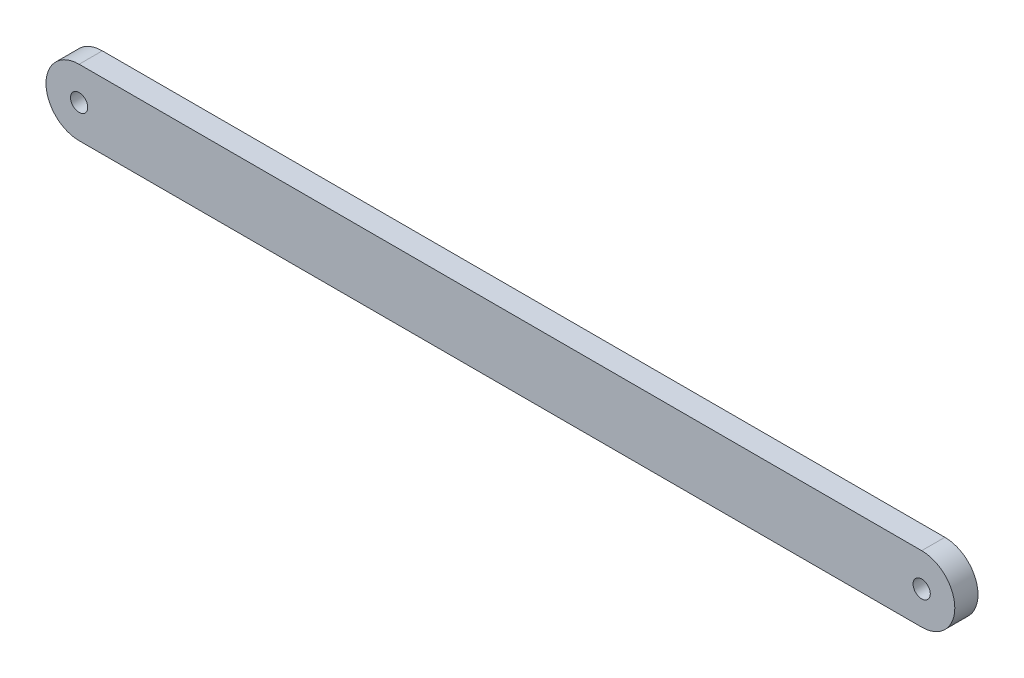
ISO-10303-21;
HEADER;
FILE_DESCRIPTION(('STEP AP214'),'2;1');
FILE_NAME('part.step','',(''),(''),'','','');
FILE_SCHEMA(('AUTOMOTIVE_DESIGN { 1 0 10303 214 1 1 1 1 }'));
ENDSEC;
DATA;
#1=APPLICATION_CONTEXT('core data for automotive mechanical design processes');
#2=APPLICATION_PROTOCOL_DEFINITION('international standard','automotive_design',2000,#1);
#3=PRODUCT_CONTEXT('',#1,'mechanical');
#4=PRODUCT('Part','Part','',(#3));
#5=PRODUCT_RELATED_PRODUCT_CATEGORY('part','',(#4));
#6=PRODUCT_DEFINITION_FORMATION('','',#4);
#7=PRODUCT_DEFINITION_CONTEXT('part definition',#1,'design');
#8=PRODUCT_DEFINITION('design','',#6,#7);
#9=PRODUCT_DEFINITION_SHAPE('','',#8);
#10=(LENGTH_UNIT() NAMED_UNIT(*) SI_UNIT(.MILLI.,.METRE.));
#11=(NAMED_UNIT(*) PLANE_ANGLE_UNIT() SI_UNIT($,.RADIAN.));
#12=(NAMED_UNIT(*) SI_UNIT($,.STERADIAN.) SOLID_ANGLE_UNIT());
#13=UNCERTAINTY_MEASURE_WITH_UNIT(LENGTH_MEASURE(1.E-05),#10,'distance_accuracy_value','');
#14=(GEOMETRIC_REPRESENTATION_CONTEXT(3) GLOBAL_UNCERTAINTY_ASSIGNED_CONTEXT((#13)) GLOBAL_UNIT_ASSIGNED_CONTEXT((#10,
#11,#12)) REPRESENTATION_CONTEXT('',''));
#15=CARTESIAN_POINT('',(0.,0.,0.));
#16=DIRECTION('',(0.,0.,1.));
#17=DIRECTION('',(1.,0.,0.));
#18=AXIS2_PLACEMENT_3D('',#15,#16,#17);
#19=CARTESIAN_POINT('',(0.,0.,-7.));
#20=DIRECTION('',(0.,0.,-1.));
#21=DIRECTION('',(1.,0.,0.));
#22=AXIS2_PLACEMENT_3D('',#19,#20,#21);
#23=PLANE('',#22);
#24=CARTESIAN_POINT('',(0.,0.,-7.));
#25=DIRECTION('',(0.,0.,1.));
#26=DIRECTION('',(1.,0.,0.));
#27=AXIS2_PLACEMENT_3D('',#24,#25,#26);
#28=CIRCLE('',#27,2.6);
#29=CARTESIAN_POINT('',(2.6,0.,-7.));
#30=VERTEX_POINT('',#29);
#31=EDGE_CURVE('E109',#30,#30,#28,.T.);
#32=ORIENTED_EDGE('',*,*,#31,.T.);
#33=EDGE_LOOP('',(#32));
#34=FACE_BOUND('',#33,.T.);
#35=CARTESIAN_POINT('',(0.,0.,-7.));
#36=DIRECTION('',(0.,0.,1.));
#37=DIRECTION('',(1.,0.,0.));
#38=AXIS2_PLACEMENT_3D('',#35,#36,#37);
#39=CIRCLE('',#38,10.);
#40=CARTESIAN_POINT('',(0.,10.,-7.));
#41=VERTEX_POINT('',#40);
#42=CARTESIAN_POINT('',(0.,-10.,-7.));
#43=VERTEX_POINT('',#42);
#44=EDGE_CURVE('E97',#41,#43,#39,.T.);
#45=ORIENTED_EDGE('',*,*,#44,.F.);
#46=DIRECTION('',(-1.,0.,0.));
#47=VECTOR('',#46,1.);
#48=CARTESIAN_POINT('',(0.,10.,-7.));
#49=LINE('',#48,#47);
#50=CARTESIAN_POINT('',(254.32,10.,-7.));
#51=VERTEX_POINT('',#50);
#52=EDGE_CURVE('E100',#51,#41,#49,.T.);
#53=ORIENTED_EDGE('',*,*,#52,.F.);
#54=CARTESIAN_POINT('',(254.32,0.,-7.));
#55=DIRECTION('',(0.,0.,1.));
#56=DIRECTION('',(1.,0.,0.));
#57=AXIS2_PLACEMENT_3D('',#54,#55,#56);
#58=CIRCLE('',#57,10.);
#59=CARTESIAN_POINT('',(254.32,-10.,-7.));
#60=VERTEX_POINT('',#59);
#61=EDGE_CURVE('E88',#60,#51,#58,.T.);
#62=ORIENTED_EDGE('',*,*,#61,.F.);
#63=DIRECTION('',(1.,0.,0.));
#64=VECTOR('',#63,1.);
#65=CARTESIAN_POINT('',(0.,-10.,-7.));
#66=LINE('',#65,#64);
#67=EDGE_CURVE('E93',#43,#60,#66,.T.);
#68=ORIENTED_EDGE('',*,*,#67,.F.);
#69=EDGE_LOOP('',(#45,#53,#62,#68));
#70=FACE_BOUND('',#69,.T.);
#71=CARTESIAN_POINT('',(254.32,0.,-7.));
#72=DIRECTION('',(0.,0.,1.));
#73=DIRECTION('',(1.,0.,0.));
#74=AXIS2_PLACEMENT_3D('',#71,#72,#73);
#75=CIRCLE('',#74,2.60000000000002);
#76=CARTESIAN_POINT('',(256.92,0.,-7.));
#77=VERTEX_POINT('',#76);
#78=EDGE_CURVE('E120',#77,#77,#75,.T.);
#79=ORIENTED_EDGE('',*,*,#78,.T.);
#80=EDGE_LOOP('',(#79));
#81=FACE_BOUND('',#80,.T.);
#82=ADVANCED_FACE('F41',(#34,#70,#81),#23,.T.);
#83=CARTESIAN_POINT('',(0.,0.,0.));
#84=DIRECTION('',(0.,0.,-1.));
#85=DIRECTION('',(1.,0.,0.));
#86=AXIS2_PLACEMENT_3D('',#83,#84,#85);
#87=PLANE('',#86);
#88=CARTESIAN_POINT('',(0.,0.,0.));
#89=DIRECTION('',(0.,0.,1.));
#90=DIRECTION('',(1.,0.,0.));
#91=AXIS2_PLACEMENT_3D('',#88,#89,#90);
#92=CIRCLE('',#91,10.);
#93=CARTESIAN_POINT('',(0.,10.,0.));
#94=VERTEX_POINT('',#93);
#95=CARTESIAN_POINT('',(0.,-10.,0.));
#96=VERTEX_POINT('',#95);
#97=EDGE_CURVE('E105',#94,#96,#92,.T.);
#98=ORIENTED_EDGE('',*,*,#97,.T.);
#99=DIRECTION('',(1.,0.,0.));
#100=VECTOR('',#99,1.);
#101=CARTESIAN_POINT('',(0.,-10.,0.));
#102=LINE('',#101,#100);
#103=CARTESIAN_POINT('',(254.32,-10.,0.));
#104=VERTEX_POINT('',#103);
#105=EDGE_CURVE('E108',#96,#104,#102,.T.);
#106=ORIENTED_EDGE('',*,*,#105,.T.);
#107=CARTESIAN_POINT('',(254.32,0.,0.));
#108=DIRECTION('',(0.,0.,1.));
#109=DIRECTION('',(1.,0.,0.));
#110=AXIS2_PLACEMENT_3D('',#107,#108,#109);
#111=CIRCLE('',#110,10.);
#112=CARTESIAN_POINT('',(254.32,10.,0.));
#113=VERTEX_POINT('',#112);
#114=EDGE_CURVE('E91',#104,#113,#111,.T.);
#115=ORIENTED_EDGE('',*,*,#114,.T.);
#116=DIRECTION('',(-1.,0.,0.));
#117=VECTOR('',#116,1.);
#118=CARTESIAN_POINT('',(0.,10.,0.));
#119=LINE('',#118,#117);
#120=EDGE_CURVE('E112',#113,#94,#119,.T.);
#121=ORIENTED_EDGE('',*,*,#120,.T.);
#122=EDGE_LOOP('',(#98,#106,#115,#121));
#123=FACE_BOUND('',#122,.T.);
#124=CARTESIAN_POINT('',(0.,0.,0.));
#125=DIRECTION('',(0.,0.,1.));
#126=DIRECTION('',(1.,0.,0.));
#127=AXIS2_PLACEMENT_3D('',#124,#125,#126);
#128=CIRCLE('',#127,2.6);
#129=CARTESIAN_POINT('',(2.6,0.,0.));
#130=VERTEX_POINT('',#129);
#131=EDGE_CURVE('E117',#130,#130,#128,.T.);
#132=ORIENTED_EDGE('',*,*,#131,.F.);
#133=EDGE_LOOP('',(#132));
#134=FACE_BOUND('',#133,.T.);
#135=CARTESIAN_POINT('',(254.32,0.,0.));
#136=DIRECTION('',(0.,0.,1.));
#137=DIRECTION('',(1.,0.,0.));
#138=AXIS2_PLACEMENT_3D('',#135,#136,#137);
#139=CIRCLE('',#138,2.60000000000002);
#140=CARTESIAN_POINT('',(256.92,0.,0.));
#141=VERTEX_POINT('',#140);
#142=EDGE_CURVE('E123',#141,#141,#139,.T.);
#143=ORIENTED_EDGE('',*,*,#142,.F.);
#144=EDGE_LOOP('',(#143));
#145=FACE_BOUND('',#144,.T.);
#146=ADVANCED_FACE('F136',(#123,#134,#145),#87,.F.);
#147=CARTESIAN_POINT('',(0.,0.,-7.));
#148=DIRECTION('',(0.,0.,1.));
#149=DIRECTION('',(-1.,0.,0.));
#150=AXIS2_PLACEMENT_3D('',#147,#148,#149);
#151=CYLINDRICAL_SURFACE('',#150,10.);
#152=ORIENTED_EDGE('',*,*,#97,.F.);
#153=DIRECTION('',(0.,0.,1.));
#154=VECTOR('',#153,1.);
#155=CARTESIAN_POINT('',(0.,10.,-7.));
#156=LINE('',#155,#154);
#157=EDGE_CURVE('E58',#41,#94,#156,.T.);
#158=ORIENTED_EDGE('',*,*,#157,.F.);
#159=ORIENTED_EDGE('',*,*,#44,.T.);
#160=DIRECTION('',(0.,0.,1.));
#161=VECTOR('',#160,1.);
#162=CARTESIAN_POINT('',(0.,-10.,-7.));
#163=LINE('',#162,#161);
#164=EDGE_CURVE('E11',#43,#96,#163,.T.);
#165=ORIENTED_EDGE('',*,*,#164,.T.);
#166=EDGE_LOOP('',(#152,#158,#159,#165));
#167=FACE_BOUND('',#166,.T.);
#168=ADVANCED_FACE('F43',(#167),#151,.T.);
#169=CARTESIAN_POINT('',(0.,-10.,-7.));
#170=DIRECTION('',(0.,1.,0.));
#171=DIRECTION('',(0.,0.,-1.));
#172=AXIS2_PLACEMENT_3D('',#169,#170,#171);
#173=PLANE('',#172);
#174=ORIENTED_EDGE('',*,*,#105,.F.);
#175=ORIENTED_EDGE('',*,*,#164,.F.);
#176=ORIENTED_EDGE('',*,*,#67,.T.);
#177=DIRECTION('',(0.,0.,1.));
#178=VECTOR('',#177,1.);
#179=CARTESIAN_POINT('',(254.32,-10.,-7.));
#180=LINE('',#179,#178);
#181=EDGE_CURVE('E50',#60,#104,#180,.T.);
#182=ORIENTED_EDGE('',*,*,#181,.T.);
#183=EDGE_LOOP('',(#174,#175,#176,#182));
#184=FACE_BOUND('',#183,.T.);
#185=ADVANCED_FACE('F94',(#184),#173,.F.);
#186=CARTESIAN_POINT('',(254.32,0.,-7.));
#187=DIRECTION('',(0.,0.,1.));
#188=DIRECTION('',(-1.,0.,0.));
#189=AXIS2_PLACEMENT_3D('',#186,#187,#188);
#190=CYLINDRICAL_SURFACE('',#189,10.);
#191=ORIENTED_EDGE('',*,*,#114,.F.);
#192=ORIENTED_EDGE('',*,*,#181,.F.);
#193=ORIENTED_EDGE('',*,*,#61,.T.);
#194=DIRECTION('',(0.,0.,1.));
#195=VECTOR('',#194,1.);
#196=CARTESIAN_POINT('',(254.32,10.,-7.));
#197=LINE('',#196,#195);
#198=EDGE_CURVE('E74',#51,#113,#197,.T.);
#199=ORIENTED_EDGE('',*,*,#198,.T.);
#200=EDGE_LOOP('',(#191,#192,#193,#199));
#201=FACE_BOUND('',#200,.T.);
#202=ADVANCED_FACE('F86',(#201),#190,.T.);
#203=CARTESIAN_POINT('',(0.,10.,-7.));
#204=DIRECTION('',(0.,-1.,0.));
#205=DIRECTION('',(0.,0.,1.));
#206=AXIS2_PLACEMENT_3D('',#203,#204,#205);
#207=PLANE('',#206);
#208=ORIENTED_EDGE('',*,*,#120,.F.);
#209=ORIENTED_EDGE('',*,*,#198,.F.);
#210=ORIENTED_EDGE('',*,*,#52,.T.);
#211=ORIENTED_EDGE('',*,*,#157,.T.);
#212=EDGE_LOOP('',(#208,#209,#210,#211));
#213=FACE_BOUND('',#212,.T.);
#214=ADVANCED_FACE('F148',(#213),#207,.F.);
#215=CARTESIAN_POINT('',(0.,0.,-7.));
#216=DIRECTION('',(0.,0.,1.));
#217=DIRECTION('',(-1.,0.,0.));
#218=AXIS2_PLACEMENT_3D('',#215,#216,#217);
#219=CYLINDRICAL_SURFACE('',#218,2.6);
#220=ORIENTED_EDGE('',*,*,#31,.F.);
#221=EDGE_LOOP('',(#220));
#222=FACE_BOUND('',#221,.T.);
#223=ORIENTED_EDGE('',*,*,#131,.T.);
#224=EDGE_LOOP('',(#223));
#225=FACE_BOUND('',#224,.T.);
#226=ADVANCED_FACE('F132',(#222,#225),#219,.F.);
#227=CARTESIAN_POINT('',(254.32,0.,-7.));
#228=DIRECTION('',(0.,0.,1.));
#229=DIRECTION('',(-1.,0.,0.));
#230=AXIS2_PLACEMENT_3D('',#227,#228,#229);
#231=CYLINDRICAL_SURFACE('',#230,2.60000000000002);
#232=ORIENTED_EDGE('',*,*,#78,.F.);
#233=EDGE_LOOP('',(#232));
#234=FACE_BOUND('',#233,.T.);
#235=ORIENTED_EDGE('',*,*,#142,.T.);
#236=EDGE_LOOP('',(#235));
#237=FACE_BOUND('',#236,.T.);
#238=ADVANCED_FACE('F129',(#234,#237),#231,.F.);
#239=CLOSED_SHELL('',(#82,#146,#168,#185,#202,#214,#226,#238));
#240=MANIFOLD_SOLID_BREP('B2',#239);
#241=ADVANCED_BREP_SHAPE_REPRESENTATION('',(#18,#240),#14);
#242=SHAPE_DEFINITION_REPRESENTATION(#9,#241);
ENDSEC;
END-ISO-10303-21;
